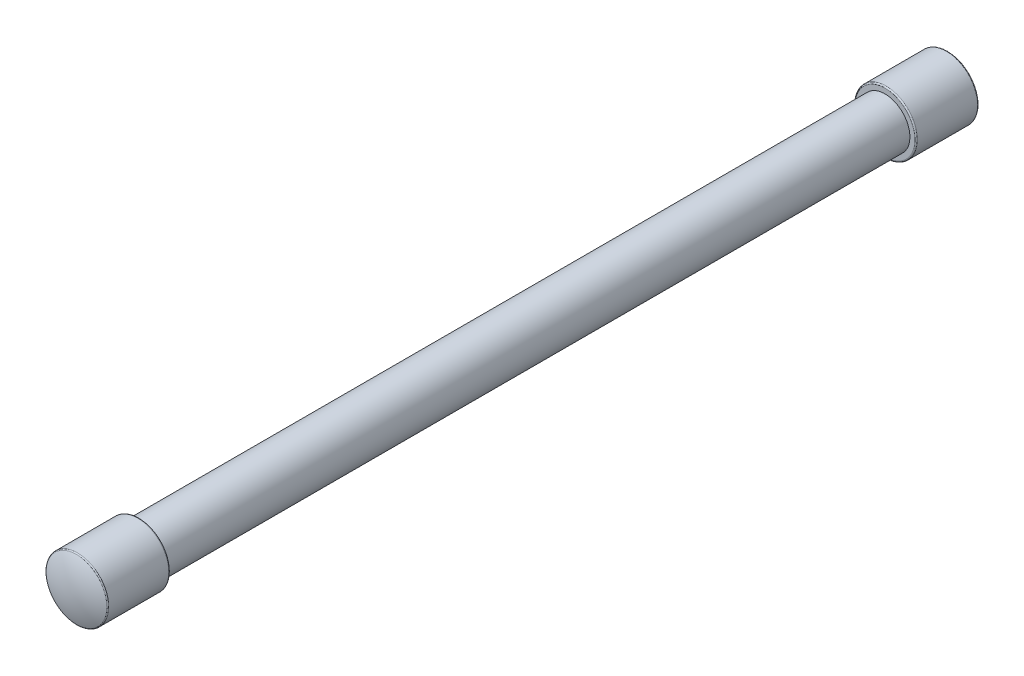
ISO-10303-21;
HEADER;
FILE_DESCRIPTION(('STEP AP214'),'2;1');
FILE_NAME('part.step','',(''),(''),'','','');
FILE_SCHEMA(('AUTOMOTIVE_DESIGN { 1 0 10303 214 1 1 1 1 }'));
ENDSEC;
DATA;
#1=APPLICATION_CONTEXT('core data for automotive mechanical design processes');
#2=APPLICATION_PROTOCOL_DEFINITION('international standard','automotive_design',2000,#1);
#3=PRODUCT_CONTEXT('',#1,'mechanical');
#4=PRODUCT('Part','Part','',(#3));
#5=PRODUCT_RELATED_PRODUCT_CATEGORY('part','',(#4));
#6=PRODUCT_DEFINITION_FORMATION('','',#4);
#7=PRODUCT_DEFINITION_CONTEXT('part definition',#1,'design');
#8=PRODUCT_DEFINITION('design','',#6,#7);
#9=PRODUCT_DEFINITION_SHAPE('','',#8);
#10=(LENGTH_UNIT() NAMED_UNIT(*) SI_UNIT(.MILLI.,.METRE.));
#11=(NAMED_UNIT(*) PLANE_ANGLE_UNIT() SI_UNIT($,.RADIAN.));
#12=(NAMED_UNIT(*) SI_UNIT($,.STERADIAN.) SOLID_ANGLE_UNIT());
#13=UNCERTAINTY_MEASURE_WITH_UNIT(LENGTH_MEASURE(1.E-05),#10,'distance_accuracy_value','');
#14=(GEOMETRIC_REPRESENTATION_CONTEXT(3) GLOBAL_UNCERTAINTY_ASSIGNED_CONTEXT((#13)) GLOBAL_UNIT_ASSIGNED_CONTEXT((#10,
#11,#12)) REPRESENTATION_CONTEXT('',''));
#15=CARTESIAN_POINT('',(0.,0.,0.));
#16=DIRECTION('',(0.,0.,1.));
#17=DIRECTION('',(1.,0.,0.));
#18=AXIS2_PLACEMENT_3D('',#15,#16,#17);
#19=CARTESIAN_POINT('',(0.,0.,0.));
#20=DIRECTION('',(0.,0.,1.));
#21=DIRECTION('',(1.,0.,0.));
#22=AXIS2_PLACEMENT_3D('',#19,#20,#21);
#23=CYLINDRICAL_SURFACE('',#22,4.);
#24=CARTESIAN_POINT('',(0.,0.,-60.));
#25=DIRECTION('',(0.,0.,1.));
#26=DIRECTION('',(1.,0.,0.));
#27=AXIS2_PLACEMENT_3D('',#24,#25,#26);
#28=CIRCLE('',#27,4.);
#29=CARTESIAN_POINT('',(4.,0.,-60.));
#30=VERTEX_POINT('',#29);
#31=EDGE_CURVE('E62',#30,#30,#28,.T.);
#32=ORIENTED_EDGE('',*,*,#31,.T.);
#33=EDGE_LOOP('',(#32));
#34=FACE_BOUND('',#33,.T.);
#35=CARTESIAN_POINT('',(0.,0.,60.));
#36=DIRECTION('',(0.,0.,1.));
#37=DIRECTION('',(1.,0.,0.));
#38=AXIS2_PLACEMENT_3D('',#35,#36,#37);
#39=CIRCLE('',#38,4.);
#40=CARTESIAN_POINT('',(4.,0.,60.));
#41=VERTEX_POINT('',#40);
#42=EDGE_CURVE('E65',#41,#41,#39,.T.);
#43=ORIENTED_EDGE('',*,*,#42,.F.);
#44=EDGE_LOOP('',(#43));
#45=FACE_BOUND('',#44,.T.);
#46=ADVANCED_FACE('F30',(#34,#45),#23,.T.);
#47=CARTESIAN_POINT('',(0.,4.,-60.));
#48=DIRECTION('',(0.,0.,-1.));
#49=DIRECTION('',(-1.,0.,0.));
#50=AXIS2_PLACEMENT_3D('',#47,#48,#49);
#51=PLANE('',#50);
#52=CARTESIAN_POINT('',(0.,0.,-60.));
#53=DIRECTION('',(0.,0.,-1.));
#54=DIRECTION('',(-1.,0.,0.));
#55=AXIS2_PLACEMENT_3D('',#52,#53,#54);
#56=CIRCLE('',#55,4.8);
#57=CARTESIAN_POINT('',(-4.8,0.,-60.));
#58=VERTEX_POINT('',#57);
#59=EDGE_CURVE('E50',#58,#58,#56,.F.);
#60=ORIENTED_EDGE('',*,*,#59,.T.);
#61=EDGE_LOOP('',(#60));
#62=FACE_BOUND('',#61,.T.);
#63=ORIENTED_EDGE('',*,*,#31,.F.);
#64=EDGE_LOOP('',(#63));
#65=FACE_BOUND('',#64,.T.);
#66=ADVANCED_FACE('F72',(#62,#65),#51,.F.);
#67=CARTESIAN_POINT('',(0.,0.,0.));
#68=DIRECTION('',(0.,0.,1.));
#69=DIRECTION('',(1.,0.,0.));
#70=AXIS2_PLACEMENT_3D('',#67,#68,#69);
#71=CYLINDRICAL_SURFACE('',#70,5.);
#72=CARTESIAN_POINT('',(0.,0.,-69.8708982679338));
#73=DIRECTION('',(0.,0.,1.));
#74=DIRECTION('',(1.,0.,0.));
#75=AXIS2_PLACEMENT_3D('',#72,#73,#74);
#76=CIRCLE('',#75,5.);
#77=CARTESIAN_POINT('',(5.,0.,-69.8708982679338));
#78=VERTEX_POINT('',#77);
#79=EDGE_CURVE('E56',#78,#78,#76,.T.);
#80=ORIENTED_EDGE('',*,*,#79,.T.);
#81=EDGE_LOOP('',(#80));
#82=FACE_BOUND('',#81,.T.);
#83=CARTESIAN_POINT('',(0.,0.,-60.2));
#84=DIRECTION('',(0.,0.,-1.));
#85=DIRECTION('',(-1.,0.,0.));
#86=AXIS2_PLACEMENT_3D('',#83,#84,#85);
#87=CIRCLE('',#86,5.);
#88=CARTESIAN_POINT('',(-5.,0.,-60.2));
#89=VERTEX_POINT('',#88);
#90=EDGE_CURVE('E59',#89,#89,#87,.T.);
#91=ORIENTED_EDGE('',*,*,#90,.T.);
#92=EDGE_LOOP('',(#91));
#93=FACE_BOUND('',#92,.T.);
#94=ADVANCED_FACE('F78',(#82,#93),#71,.T.);
#95=CARTESIAN_POINT('',(0.,0.,-59.0912878853643));
#96=DIRECTION('',(0.,0.,1.));
#97=DIRECTION('',(0.,1.,0.));
#98=AXIS2_PLACEMENT_3D('',#95,#96,#97);
#99=SPHERICAL_SURFACE('',#98,12.);
#100=CARTESIAN_POINT('',(0.,0.,-70.0536035286553));
#101=DIRECTION('',(0.,0.,1.));
#102=DIRECTION('',(1.,0.,0.));
#103=AXIS2_PLACEMENT_3D('',#100,#101,#102);
#104=CIRCLE('',#103,4.88135593220339);
#105=CARTESIAN_POINT('',(4.88135593220339,0.,-70.0536035286553));
#106=VERTEX_POINT('',#105);
#107=EDGE_CURVE('E53',#106,#106,#104,.F.);
#108=ORIENTED_EDGE('',*,*,#107,.T.);
#109=EDGE_LOOP('',(#108));
#110=FACE_BOUND('',#109,.T.);
#111=ADVANCED_FACE('F111',(#110),#99,.T.);
#112=CARTESIAN_POINT('',(0.,4.,60.));
#113=DIRECTION('',(0.,0.,1.));
#114=DIRECTION('',(-1.,0.,0.));
#115=AXIS2_PLACEMENT_3D('',#112,#113,#114);
#116=PLANE('',#115);
#117=CARTESIAN_POINT('',(0.,0.,60.));
#118=DIRECTION('',(0.,0.,1.));
#119=DIRECTION('',(1.,0.,0.));
#120=AXIS2_PLACEMENT_3D('',#117,#118,#119);
#121=CIRCLE('',#120,4.8);
#122=CARTESIAN_POINT('',(4.8,0.,60.));
#123=VERTEX_POINT('',#122);
#124=EDGE_CURVE('E10',#123,#123,#121,.F.);
#125=ORIENTED_EDGE('',*,*,#124,.T.);
#126=EDGE_LOOP('',(#125));
#127=FACE_BOUND('',#126,.T.);
#128=ORIENTED_EDGE('',*,*,#42,.T.);
#129=EDGE_LOOP('',(#128));
#130=FACE_BOUND('',#129,.T.);
#131=ADVANCED_FACE('F69',(#127,#130),#116,.F.);
#132=CARTESIAN_POINT('',(0.,0.,0.));
#133=DIRECTION('',(0.,0.,-1.));
#134=DIRECTION('',(1.,0.,0.));
#135=AXIS2_PLACEMENT_3D('',#132,#133,#134);
#136=CYLINDRICAL_SURFACE('',#135,5.);
#137=CARTESIAN_POINT('',(0.,0.,69.8708982679338));
#138=DIRECTION('',(0.,0.,-1.));
#139=DIRECTION('',(-1.,0.,0.));
#140=AXIS2_PLACEMENT_3D('',#137,#138,#139);
#141=CIRCLE('',#140,5.);
#142=CARTESIAN_POINT('',(-5.,0.,69.8708982679338));
#143=VERTEX_POINT('',#142);
#144=EDGE_CURVE('E37',#143,#143,#141,.T.);
#145=ORIENTED_EDGE('',*,*,#144,.T.);
#146=EDGE_LOOP('',(#145));
#147=FACE_BOUND('',#146,.T.);
#148=CARTESIAN_POINT('',(0.,0.,60.2));
#149=DIRECTION('',(0.,0.,1.));
#150=DIRECTION('',(1.,0.,0.));
#151=AXIS2_PLACEMENT_3D('',#148,#149,#150);
#152=CIRCLE('',#151,5.);
#153=CARTESIAN_POINT('',(5.,0.,60.2));
#154=VERTEX_POINT('',#153);
#155=EDGE_CURVE('E41',#154,#154,#152,.T.);
#156=ORIENTED_EDGE('',*,*,#155,.T.);
#157=EDGE_LOOP('',(#156));
#158=FACE_BOUND('',#157,.T.);
#159=ADVANCED_FACE('F102',(#147,#158),#136,.T.);
#160=CARTESIAN_POINT('',(0.,0.,59.0912878853643));
#161=DIRECTION('',(0.,0.,-1.));
#162=DIRECTION('',(0.,1.,0.));
#163=AXIS2_PLACEMENT_3D('',#160,#161,#162);
#164=SPHERICAL_SURFACE('',#163,12.);
#165=CARTESIAN_POINT('',(0.,0.,70.0536035286553));
#166=DIRECTION('',(0.,0.,-1.));
#167=DIRECTION('',(-1.,0.,0.));
#168=AXIS2_PLACEMENT_3D('',#165,#166,#167);
#169=CIRCLE('',#168,4.88135593220339);
#170=CARTESIAN_POINT('',(-4.88135593220339,0.,70.0536035286553));
#171=VERTEX_POINT('',#170);
#172=EDGE_CURVE('E45',#171,#171,#169,.F.);
#173=ORIENTED_EDGE('',*,*,#172,.T.);
#174=EDGE_LOOP('',(#173));
#175=FACE_BOUND('',#174,.T.);
#176=ADVANCED_FACE('F87',(#175),#164,.T.);
#177=CARTESIAN_POINT('',(0.,0.,-69.8708982679338));
#178=DIRECTION('',(0.,0.,1.));
#179=DIRECTION('',(1.,0.,0.));
#180=AXIS2_PLACEMENT_3D('',#177,#178,#179);
#181=TOROIDAL_SURFACE('',#180,4.8,0.2);
#182=ORIENTED_EDGE('',*,*,#107,.F.);
#183=EDGE_LOOP('',(#182));
#184=FACE_BOUND('',#183,.T.);
#185=ORIENTED_EDGE('',*,*,#79,.F.);
#186=EDGE_LOOP('',(#185));
#187=FACE_BOUND('',#186,.T.);
#188=ADVANCED_FACE('F83',(#184,#187),#181,.T.);
#189=CARTESIAN_POINT('',(0.,0.,-60.2));
#190=DIRECTION('',(0.,0.,-1.));
#191=DIRECTION('',(-1.,0.,0.));
#192=AXIS2_PLACEMENT_3D('',#189,#190,#191);
#193=TOROIDAL_SURFACE('',#192,4.8,0.2);
#194=ORIENTED_EDGE('',*,*,#90,.F.);
#195=EDGE_LOOP('',(#194));
#196=FACE_BOUND('',#195,.T.);
#197=ORIENTED_EDGE('',*,*,#59,.F.);
#198=EDGE_LOOP('',(#197));
#199=FACE_BOUND('',#198,.T.);
#200=ADVANCED_FACE('F86',(#196,#199),#193,.T.);
#201=CARTESIAN_POINT('',(0.,0.,69.8708982679338));
#202=DIRECTION('',(0.,0.,-1.));
#203=DIRECTION('',(-1.,0.,0.));
#204=AXIS2_PLACEMENT_3D('',#201,#202,#203);
#205=TOROIDAL_SURFACE('',#204,4.8,0.2);
#206=ORIENTED_EDGE('',*,*,#144,.F.);
#207=EDGE_LOOP('',(#206));
#208=FACE_BOUND('',#207,.T.);
#209=ORIENTED_EDGE('',*,*,#172,.F.);
#210=EDGE_LOOP('',(#209));
#211=FACE_BOUND('',#210,.T.);
#212=ADVANCED_FACE('F90',(#208,#211),#205,.T.);
#213=CARTESIAN_POINT('',(0.,0.,60.2));
#214=DIRECTION('',(0.,0.,1.));
#215=DIRECTION('',(1.,0.,0.));
#216=AXIS2_PLACEMENT_3D('',#213,#214,#215);
#217=TOROIDAL_SURFACE('',#216,4.8,0.2);
#218=ORIENTED_EDGE('',*,*,#124,.F.);
#219=EDGE_LOOP('',(#218));
#220=FACE_BOUND('',#219,.T.);
#221=ORIENTED_EDGE('',*,*,#155,.F.);
#222=EDGE_LOOP('',(#221));
#223=FACE_BOUND('',#222,.T.);
#224=ADVANCED_FACE('F32',(#220,#223),#217,.T.);
#225=CLOSED_SHELL('',(#46,#66,#94,#111,#131,#159,#176,#188,#200,#212,#224));
#226=MANIFOLD_SOLID_BREP('B2',#225);
#227=ADVANCED_BREP_SHAPE_REPRESENTATION('',(#18,#226),#14);
#228=SHAPE_DEFINITION_REPRESENTATION(#9,#227);
ENDSEC;
END-ISO-10303-21;
